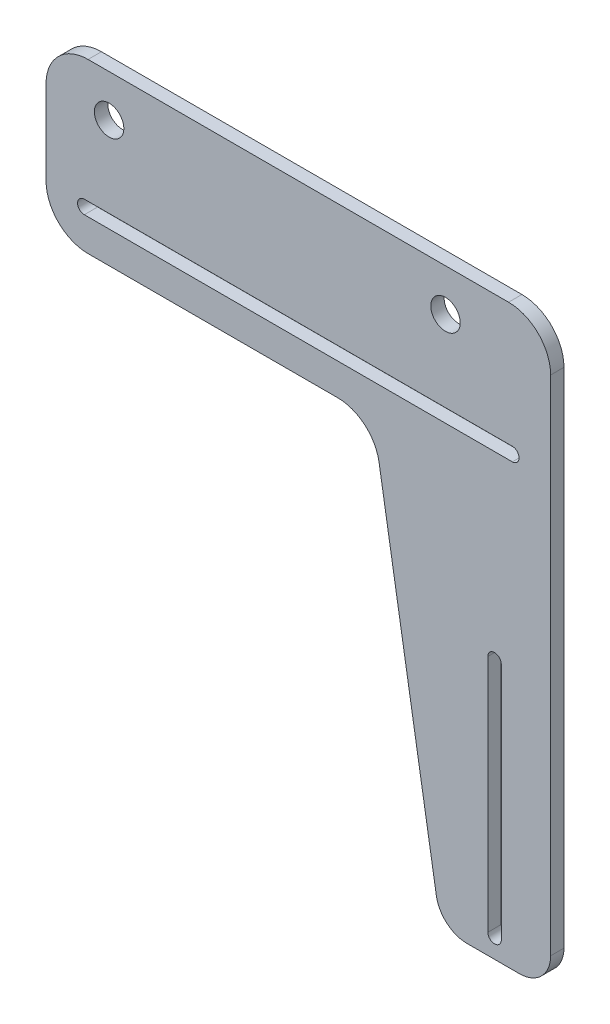
ISO-10303-21;
HEADER;
FILE_DESCRIPTION(('STEP AP214'),'2;1');
FILE_NAME('part.step','',(''),(''),'','','');
FILE_SCHEMA(('AUTOMOTIVE_DESIGN { 1 0 10303 214 1 1 1 1 }'));
ENDSEC;
DATA;
#1=APPLICATION_CONTEXT('core data for automotive mechanical design processes');
#2=APPLICATION_PROTOCOL_DEFINITION('international standard','automotive_design',2000,#1);
#3=PRODUCT_CONTEXT('',#1,'mechanical');
#4=PRODUCT('Part','Part','',(#3));
#5=PRODUCT_RELATED_PRODUCT_CATEGORY('part','',(#4));
#6=PRODUCT_DEFINITION_FORMATION('','',#4);
#7=PRODUCT_DEFINITION_CONTEXT('part definition',#1,'design');
#8=PRODUCT_DEFINITION('design','',#6,#7);
#9=PRODUCT_DEFINITION_SHAPE('','',#8);
#10=(LENGTH_UNIT() NAMED_UNIT(*) SI_UNIT(.MILLI.,.METRE.));
#11=(NAMED_UNIT(*) PLANE_ANGLE_UNIT() SI_UNIT($,.RADIAN.));
#12=(NAMED_UNIT(*) SI_UNIT($,.STERADIAN.) SOLID_ANGLE_UNIT());
#13=UNCERTAINTY_MEASURE_WITH_UNIT(LENGTH_MEASURE(1.E-05),#10,'distance_accuracy_value','');
#14=(GEOMETRIC_REPRESENTATION_CONTEXT(3) GLOBAL_UNCERTAINTY_ASSIGNED_CONTEXT((#13)) GLOBAL_UNIT_ASSIGNED_CONTEXT((#10,
#11,#12)) REPRESENTATION_CONTEXT('',''));
#15=CARTESIAN_POINT('',(0.,0.,0.));
#16=DIRECTION('',(0.,0.,1.));
#17=DIRECTION('',(1.,0.,0.));
#18=AXIS2_PLACEMENT_3D('',#15,#16,#17);
#19=CARTESIAN_POINT('',(40.132559776358,-74.617650604248,0.));
#20=DIRECTION('',(0.,0.,1.));
#21=DIRECTION('',(1.,0.,0.));
#22=AXIS2_PLACEMENT_3D('',#19,#20,#21);
#23=CYLINDRICAL_SURFACE('',#22,7.40000000000001);
#24=CARTESIAN_POINT('',(40.132559776358,-74.617650604248,3.175));
#25=DIRECTION('',(0.,0.,1.));
#26=DIRECTION('',(1.,0.,0.));
#27=AXIS2_PLACEMENT_3D('',#24,#25,#26);
#28=CIRCLE('',#27,7.40000000000001);
#29=CARTESIAN_POINT('',(32.8316512362823,-75.8246031672972,3.175));
#30=VERTEX_POINT('',#29);
#31=CARTESIAN_POINT('',(40.132559776358,-82.017650604248,3.175));
#32=VERTEX_POINT('',#31);
#33=EDGE_CURVE('E238',#30,#32,#28,.T.);
#34=ORIENTED_EDGE('',*,*,#33,.F.);
#35=DIRECTION('',(0.,0.,1.));
#36=VECTOR('',#35,1.);
#37=CARTESIAN_POINT('',(32.8316512362823,-75.8246031672972,0.));
#38=LINE('',#37,#36);
#39=CARTESIAN_POINT('',(32.8316512362823,-75.8246031672972,0.));
#40=VERTEX_POINT('',#39);
#41=EDGE_CURVE('E11',#40,#30,#38,.T.);
#42=ORIENTED_EDGE('',*,*,#41,.F.);
#43=CARTESIAN_POINT('',(40.132559776358,-74.617650604248,0.));
#44=DIRECTION('',(0.,0.,1.));
#45=DIRECTION('',(1.,0.,0.));
#46=AXIS2_PLACEMENT_3D('',#43,#44,#45);
#47=CIRCLE('',#46,7.40000000000001);
#48=CARTESIAN_POINT('',(40.132559776358,-82.017650604248,0.));
#49=VERTEX_POINT('',#48);
#50=EDGE_CURVE('E245',#40,#49,#47,.T.);
#51=ORIENTED_EDGE('',*,*,#50,.T.);
#52=DIRECTION('',(0.,0.,1.));
#53=VECTOR('',#52,1.);
#54=CARTESIAN_POINT('',(40.132559776358,-82.017650604248,0.));
#55=LINE('',#54,#53);
#56=EDGE_CURVE('E39',#49,#32,#55,.T.);
#57=ORIENTED_EDGE('',*,*,#56,.T.);
#58=EDGE_LOOP('',(#34,#42,#51,#57));
#59=FACE_BOUND('',#58,.T.);
#60=ADVANCED_FACE('F36',(#59),#23,.T.);
#61=CARTESIAN_POINT('',(19.2004680041138,6.63101697709338,0.));
#62=DIRECTION('',(-0.986609262172382,-0.163101697709337,0.));
#63=DIRECTION('',(0.163101697709337,-0.986609262172382,0.));
#64=AXIS2_PLACEMENT_3D('',#61,#62,#63);
#65=PLANE('',#64);
#66=DIRECTION('',(0.163101697709337,-0.986609262172382,0.));
#67=VECTOR('',#66,1.);
#68=CARTESIAN_POINT('',(19.2004680041138,6.63101697709338,3.175));
#69=LINE('',#68,#67);
#70=CARTESIAN_POINT('',(19.2004680041138,6.63101697709338,3.175));
#71=VERTEX_POINT('',#70);
#72=EDGE_CURVE('E249',#71,#30,#69,.T.);
#73=ORIENTED_EDGE('',*,*,#72,.F.);
#74=DIRECTION('',(0.,0.,1.));
#75=VECTOR('',#74,1.);
#76=CARTESIAN_POINT('',(19.2004680041138,6.63101697709338,0.));
#77=LINE('',#76,#75);
#78=CARTESIAN_POINT('',(19.2004680041138,6.63101697709338,0.));
#79=VERTEX_POINT('',#78);
#80=EDGE_CURVE('E44',#79,#71,#77,.T.);
#81=ORIENTED_EDGE('',*,*,#80,.F.);
#82=DIRECTION('',(0.163101697709337,-0.986609262172382,0.));
#83=VECTOR('',#82,1.);
#84=CARTESIAN_POINT('',(19.2004680041138,6.63101697709338,0.));
#85=LINE('',#84,#83);
#86=EDGE_CURVE('E279',#79,#40,#85,.T.);
#87=ORIENTED_EDGE('',*,*,#86,.T.);
#88=ORIENTED_EDGE('',*,*,#41,.T.);
#89=EDGE_LOOP('',(#73,#81,#87,#88));
#90=FACE_BOUND('',#89,.T.);
#91=ADVANCED_FACE('F345',(#90),#65,.T.);
#92=CARTESIAN_POINT('',(9.33437538238997,5.,0.));
#93=DIRECTION('',(0.,0.,1.));
#94=DIRECTION('',(1.,0.,0.));
#95=AXIS2_PLACEMENT_3D('',#92,#93,#94);
#96=CYLINDRICAL_SURFACE('',#95,10.);
#97=CARTESIAN_POINT('',(9.33437538238997,5.,3.175));
#98=DIRECTION('',(0.,0.,-1.));
#99=DIRECTION('',(-1.,0.,0.));
#100=AXIS2_PLACEMENT_3D('',#97,#98,#99);
#101=CIRCLE('',#100,10.);
#102=CARTESIAN_POINT('',(9.33437538238997,15.,3.175));
#103=VERTEX_POINT('',#102);
#104=EDGE_CURVE('E311',#103,#71,#101,.T.);
#105=ORIENTED_EDGE('',*,*,#104,.F.);
#106=DIRECTION('',(0.,0.,1.));
#107=VECTOR('',#106,1.);
#108=CARTESIAN_POINT('',(9.33437538238997,15.,0.));
#109=LINE('',#108,#107);
#110=CARTESIAN_POINT('',(9.33437538238997,15.,0.));
#111=VERTEX_POINT('',#110);
#112=EDGE_CURVE('E317',#111,#103,#109,.T.);
#113=ORIENTED_EDGE('',*,*,#112,.F.);
#114=CARTESIAN_POINT('',(9.33437538238997,5.,0.));
#115=DIRECTION('',(0.,0.,-1.));
#116=DIRECTION('',(-1.,0.,0.));
#117=AXIS2_PLACEMENT_3D('',#114,#115,#116);
#118=CIRCLE('',#117,10.);
#119=EDGE_CURVE('E276',#111,#79,#118,.T.);
#120=ORIENTED_EDGE('',*,*,#119,.T.);
#121=ORIENTED_EDGE('',*,*,#80,.T.);
#122=EDGE_LOOP('',(#105,#113,#120,#121));
#123=FACE_BOUND('',#122,.T.);
#124=ADVANCED_FACE('F382',(#123),#96,.F.);
#125=CARTESIAN_POINT('',(-50.,15.,0.));
#126=DIRECTION('',(0.,-1.,0.));
#127=DIRECTION('',(0.,0.,-1.));
#128=AXIS2_PLACEMENT_3D('',#125,#126,#127);
#129=PLANE('',#128);
#130=DIRECTION('',(1.,0.,0.));
#131=VECTOR('',#130,1.);
#132=CARTESIAN_POINT('',(-50.,15.,3.175));
#133=LINE('',#132,#131);
#134=CARTESIAN_POINT('',(-50.,15.,3.175));
#135=VERTEX_POINT('',#134);
#136=EDGE_CURVE('E308',#135,#103,#133,.T.);
#137=ORIENTED_EDGE('',*,*,#136,.F.);
#138=DIRECTION('',(0.,0.,1.));
#139=VECTOR('',#138,1.);
#140=CARTESIAN_POINT('',(-50.,15.,0.));
#141=LINE('',#140,#139);
#142=CARTESIAN_POINT('',(-50.,15.,0.));
#143=VERTEX_POINT('',#142);
#144=EDGE_CURVE('E319',#143,#135,#141,.T.);
#145=ORIENTED_EDGE('',*,*,#144,.F.);
#146=DIRECTION('',(1.,0.,0.));
#147=VECTOR('',#146,1.);
#148=CARTESIAN_POINT('',(-50.,15.,0.));
#149=LINE('',#148,#147);
#150=EDGE_CURVE('E273',#143,#111,#149,.T.);
#151=ORIENTED_EDGE('',*,*,#150,.T.);
#152=ORIENTED_EDGE('',*,*,#112,.T.);
#153=EDGE_LOOP('',(#137,#145,#151,#152));
#154=FACE_BOUND('',#153,.T.);
#155=ADVANCED_FACE('F379',(#154),#129,.T.);
#156=CARTESIAN_POINT('',(-50.,25.,0.));
#157=DIRECTION('',(0.,0.,1.));
#158=DIRECTION('',(1.,0.,0.));
#159=AXIS2_PLACEMENT_3D('',#156,#157,#158);
#160=CYLINDRICAL_SURFACE('',#159,10.);
#161=CARTESIAN_POINT('',(-50.,25.,3.175));
#162=DIRECTION('',(0.,0.,1.));
#163=DIRECTION('',(1.,0.,0.));
#164=AXIS2_PLACEMENT_3D('',#161,#162,#163);
#165=CIRCLE('',#164,10.);
#166=CARTESIAN_POINT('',(-60.,25.,3.175));
#167=VERTEX_POINT('',#166);
#168=EDGE_CURVE('E305',#167,#135,#165,.T.);
#169=ORIENTED_EDGE('',*,*,#168,.F.);
#170=DIRECTION('',(0.,0.,1.));
#171=VECTOR('',#170,1.);
#172=CARTESIAN_POINT('',(-60.,25.,0.));
#173=LINE('',#172,#171);
#174=CARTESIAN_POINT('',(-60.,25.,0.));
#175=VERTEX_POINT('',#174);
#176=EDGE_CURVE('E321',#175,#167,#173,.T.);
#177=ORIENTED_EDGE('',*,*,#176,.F.);
#178=CARTESIAN_POINT('',(-50.,25.,0.));
#179=DIRECTION('',(0.,0.,1.));
#180=DIRECTION('',(1.,0.,0.));
#181=AXIS2_PLACEMENT_3D('',#178,#179,#180);
#182=CIRCLE('',#181,10.);
#183=EDGE_CURVE('E270',#175,#143,#182,.T.);
#184=ORIENTED_EDGE('',*,*,#183,.T.);
#185=ORIENTED_EDGE('',*,*,#144,.T.);
#186=EDGE_LOOP('',(#169,#177,#184,#185));
#187=FACE_BOUND('',#186,.T.);
#188=ADVANCED_FACE('F376',(#187),#160,.T.);
#189=CARTESIAN_POINT('',(-60.,45.,0.));
#190=DIRECTION('',(-1.,0.,0.));
#191=DIRECTION('',(0.,0.,1.));
#192=AXIS2_PLACEMENT_3D('',#189,#190,#191);
#193=PLANE('',#192);
#194=DIRECTION('',(0.,-1.,0.));
#195=VECTOR('',#194,1.);
#196=CARTESIAN_POINT('',(-60.,45.,3.175));
#197=LINE('',#196,#195);
#198=CARTESIAN_POINT('',(-60.,45.,3.175));
#199=VERTEX_POINT('',#198);
#200=EDGE_CURVE('E302',#199,#167,#197,.T.);
#201=ORIENTED_EDGE('',*,*,#200,.F.);
#202=DIRECTION('',(0.,0.,1.));
#203=VECTOR('',#202,1.);
#204=CARTESIAN_POINT('',(-60.,45.,0.));
#205=LINE('',#204,#203);
#206=CARTESIAN_POINT('',(-60.,45.,0.));
#207=VERTEX_POINT('',#206);
#208=EDGE_CURVE('E323',#207,#199,#205,.T.);
#209=ORIENTED_EDGE('',*,*,#208,.F.);
#210=DIRECTION('',(0.,-1.,0.));
#211=VECTOR('',#210,1.);
#212=CARTESIAN_POINT('',(-60.,45.,0.));
#213=LINE('',#212,#211);
#214=EDGE_CURVE('E267',#207,#175,#213,.T.);
#215=ORIENTED_EDGE('',*,*,#214,.T.);
#216=ORIENTED_EDGE('',*,*,#176,.T.);
#217=EDGE_LOOP('',(#201,#209,#215,#216));
#218=FACE_BOUND('',#217,.T.);
#219=ADVANCED_FACE('F372',(#218),#193,.T.);
#220=CARTESIAN_POINT('',(-50.,45.,0.));
#221=DIRECTION('',(0.,0.,1.));
#222=DIRECTION('',(1.,0.,0.));
#223=AXIS2_PLACEMENT_3D('',#220,#221,#222);
#224=CYLINDRICAL_SURFACE('',#223,10.);
#225=CARTESIAN_POINT('',(-50.,45.,3.175));
#226=DIRECTION('',(0.,0.,1.));
#227=DIRECTION('',(1.,0.,0.));
#228=AXIS2_PLACEMENT_3D('',#225,#226,#227);
#229=CIRCLE('',#228,10.);
#230=CARTESIAN_POINT('',(-50.,55.,3.175));
#231=VERTEX_POINT('',#230);
#232=EDGE_CURVE('E299',#231,#199,#229,.T.);
#233=ORIENTED_EDGE('',*,*,#232,.F.);
#234=DIRECTION('',(0.,0.,1.));
#235=VECTOR('',#234,1.);
#236=CARTESIAN_POINT('',(-50.,55.,0.));
#237=LINE('',#236,#235);
#238=CARTESIAN_POINT('',(-50.,55.,0.));
#239=VERTEX_POINT('',#238);
#240=EDGE_CURVE('E325',#239,#231,#237,.T.);
#241=ORIENTED_EDGE('',*,*,#240,.F.);
#242=CARTESIAN_POINT('',(-50.,45.,0.));
#243=DIRECTION('',(0.,0.,1.));
#244=DIRECTION('',(1.,0.,0.));
#245=AXIS2_PLACEMENT_3D('',#242,#243,#244);
#246=CIRCLE('',#245,10.);
#247=EDGE_CURVE('E264',#239,#207,#246,.T.);
#248=ORIENTED_EDGE('',*,*,#247,.T.);
#249=ORIENTED_EDGE('',*,*,#208,.T.);
#250=EDGE_LOOP('',(#233,#241,#248,#249));
#251=FACE_BOUND('',#250,.T.);
#252=ADVANCED_FACE('F368',(#251),#224,.T.);
#253=CARTESIAN_POINT('',(50.0000000000003,55.,0.));
#254=DIRECTION('',(0.,1.,0.));
#255=DIRECTION('',(0.,0.,1.));
#256=AXIS2_PLACEMENT_3D('',#253,#254,#255);
#257=PLANE('',#256);
#258=DIRECTION('',(-1.,0.,0.));
#259=VECTOR('',#258,1.);
#260=CARTESIAN_POINT('',(50.0000000000003,55.,3.175));
#261=LINE('',#260,#259);
#262=CARTESIAN_POINT('',(50.0000000000003,55.,3.175));
#263=VERTEX_POINT('',#262);
#264=EDGE_CURVE('E296',#263,#231,#261,.T.);
#265=ORIENTED_EDGE('',*,*,#264,.F.);
#266=DIRECTION('',(0.,0.,1.));
#267=VECTOR('',#266,1.);
#268=CARTESIAN_POINT('',(50.0000000000003,55.,0.));
#269=LINE('',#268,#267);
#270=CARTESIAN_POINT('',(50.0000000000003,55.,0.));
#271=VERTEX_POINT('',#270);
#272=EDGE_CURVE('E327',#271,#263,#269,.T.);
#273=ORIENTED_EDGE('',*,*,#272,.F.);
#274=DIRECTION('',(-1.,0.,0.));
#275=VECTOR('',#274,1.);
#276=CARTESIAN_POINT('',(50.0000000000003,55.,0.));
#277=LINE('',#276,#275);
#278=EDGE_CURVE('E261',#271,#239,#277,.T.);
#279=ORIENTED_EDGE('',*,*,#278,.T.);
#280=ORIENTED_EDGE('',*,*,#240,.T.);
#281=EDGE_LOOP('',(#265,#273,#279,#280));
#282=FACE_BOUND('',#281,.T.);
#283=ADVANCED_FACE('F364',(#282),#257,.T.);
#284=CARTESIAN_POINT('',(50.0000000000003,45.,0.));
#285=DIRECTION('',(0.,0.,1.));
#286=DIRECTION('',(1.,0.,0.));
#287=AXIS2_PLACEMENT_3D('',#284,#285,#286);
#288=CYLINDRICAL_SURFACE('',#287,9.99999999999998);
#289=CARTESIAN_POINT('',(50.0000000000003,45.,3.175));
#290=DIRECTION('',(0.,0.,1.));
#291=DIRECTION('',(1.,0.,0.));
#292=AXIS2_PLACEMENT_3D('',#289,#290,#291);
#293=CIRCLE('',#292,9.99999999999998);
#294=CARTESIAN_POINT('',(60.0000000000003,45.,3.175));
#295=VERTEX_POINT('',#294);
#296=EDGE_CURVE('E293',#295,#263,#293,.T.);
#297=ORIENTED_EDGE('',*,*,#296,.F.);
#298=DIRECTION('',(0.,0.,1.));
#299=VECTOR('',#298,1.);
#300=CARTESIAN_POINT('',(60.0000000000003,45.,0.));
#301=LINE('',#300,#299);
#302=CARTESIAN_POINT('',(60.0000000000003,45.,0.));
#303=VERTEX_POINT('',#302);
#304=EDGE_CURVE('E329',#303,#295,#301,.T.);
#305=ORIENTED_EDGE('',*,*,#304,.F.);
#306=CARTESIAN_POINT('',(50.0000000000003,45.,0.));
#307=DIRECTION('',(0.,0.,1.));
#308=DIRECTION('',(1.,0.,0.));
#309=AXIS2_PLACEMENT_3D('',#306,#307,#308);
#310=CIRCLE('',#309,9.99999999999998);
#311=EDGE_CURVE('E258',#303,#271,#310,.T.);
#312=ORIENTED_EDGE('',*,*,#311,.T.);
#313=ORIENTED_EDGE('',*,*,#272,.T.);
#314=EDGE_LOOP('',(#297,#305,#312,#313));
#315=FACE_BOUND('',#314,.T.);
#316=ADVANCED_FACE('F360',(#315),#288,.T.);
#317=CARTESIAN_POINT('',(59.9999999999999,-74.617650604248,0.));
#318=DIRECTION('',(1.,0.,0.));
#319=DIRECTION('',(0.,1.,0.));
#320=AXIS2_PLACEMENT_3D('',#317,#318,#319);
#321=PLANE('',#320);
#322=DIRECTION('',(0.,1.,0.));
#323=VECTOR('',#322,1.);
#324=CARTESIAN_POINT('',(59.9999999999999,-74.617650604248,3.175));
#325=LINE('',#324,#323);
#326=CARTESIAN_POINT('',(59.9999999999999,-74.617650604248,3.175));
#327=VERTEX_POINT('',#326);
#328=EDGE_CURVE('E290',#327,#295,#325,.T.);
#329=ORIENTED_EDGE('',*,*,#328,.F.);
#330=DIRECTION('',(0.,0.,1.));
#331=VECTOR('',#330,1.);
#332=CARTESIAN_POINT('',(59.9999999999999,-74.617650604248,0.));
#333=LINE('',#332,#331);
#334=CARTESIAN_POINT('',(59.9999999999999,-74.617650604248,0.));
#335=VERTEX_POINT('',#334);
#336=EDGE_CURVE('E331',#335,#327,#333,.T.);
#337=ORIENTED_EDGE('',*,*,#336,.F.);
#338=DIRECTION('',(0.,1.,0.));
#339=VECTOR('',#338,1.);
#340=CARTESIAN_POINT('',(59.9999999999999,-74.617650604248,0.));
#341=LINE('',#340,#339);
#342=EDGE_CURVE('E255',#335,#303,#341,.T.);
#343=ORIENTED_EDGE('',*,*,#342,.T.);
#344=ORIENTED_EDGE('',*,*,#304,.T.);
#345=EDGE_LOOP('',(#329,#337,#343,#344));
#346=FACE_BOUND('',#345,.T.);
#347=ADVANCED_FACE('F358',(#346),#321,.T.);
#348=CARTESIAN_POINT('',(52.5999999999999,-74.617650604248,0.));
#349=DIRECTION('',(0.,0.,1.));
#350=DIRECTION('',(1.,0.,0.));
#351=AXIS2_PLACEMENT_3D('',#348,#349,#350);
#352=CYLINDRICAL_SURFACE('',#351,7.39999999999999);
#353=CARTESIAN_POINT('',(52.5999999999999,-74.617650604248,3.175));
#354=DIRECTION('',(0.,0.,1.));
#355=DIRECTION('',(1.,0.,0.));
#356=AXIS2_PLACEMENT_3D('',#353,#354,#355);
#357=CIRCLE('',#356,7.39999999999999);
#358=CARTESIAN_POINT('',(52.5999999999999,-82.017650604248,3.175));
#359=VERTEX_POINT('',#358);
#360=EDGE_CURVE('E287',#359,#327,#357,.T.);
#361=ORIENTED_EDGE('',*,*,#360,.F.);
#362=DIRECTION('',(0.,0.,1.));
#363=VECTOR('',#362,1.);
#364=CARTESIAN_POINT('',(52.5999999999999,-82.017650604248,0.));
#365=LINE('',#364,#363);
#366=CARTESIAN_POINT('',(52.5999999999999,-82.017650604248,0.));
#367=VERTEX_POINT('',#366);
#368=EDGE_CURVE('E332',#367,#359,#365,.T.);
#369=ORIENTED_EDGE('',*,*,#368,.F.);
#370=CARTESIAN_POINT('',(52.5999999999999,-74.617650604248,0.));
#371=DIRECTION('',(0.,0.,1.));
#372=DIRECTION('',(1.,0.,0.));
#373=AXIS2_PLACEMENT_3D('',#370,#371,#372);
#374=CIRCLE('',#373,7.39999999999999);
#375=EDGE_CURVE('E252',#367,#335,#374,.T.);
#376=ORIENTED_EDGE('',*,*,#375,.T.);
#377=ORIENTED_EDGE('',*,*,#336,.T.);
#378=EDGE_LOOP('',(#361,#369,#376,#377));
#379=FACE_BOUND('',#378,.T.);
#380=ADVANCED_FACE('F354',(#379),#352,.T.);
#381=CARTESIAN_POINT('',(40.132559776358,-82.017650604248,0.));
#382=DIRECTION('',(0.,-1.,0.));
#383=DIRECTION('',(1.,0.,0.));
#384=AXIS2_PLACEMENT_3D('',#381,#382,#383);
#385=PLANE('',#384);
#386=DIRECTION('',(1.,0.,0.));
#387=VECTOR('',#386,1.);
#388=CARTESIAN_POINT('',(40.132559776358,-82.017650604248,3.175));
#389=LINE('',#388,#387);
#390=EDGE_CURVE('E284',#32,#359,#389,.T.);
#391=ORIENTED_EDGE('',*,*,#390,.F.);
#392=ORIENTED_EDGE('',*,*,#56,.F.);
#393=DIRECTION('',(1.,0.,0.));
#394=VECTOR('',#393,1.);
#395=CARTESIAN_POINT('',(40.132559776358,-82.017650604248,0.));
#396=LINE('',#395,#394);
#397=EDGE_CURVE('E248',#49,#367,#396,.T.);
#398=ORIENTED_EDGE('',*,*,#397,.T.);
#399=ORIENTED_EDGE('',*,*,#368,.T.);
#400=EDGE_LOOP('',(#391,#392,#398,#399));
#401=FACE_BOUND('',#400,.T.);
#402=ADVANCED_FACE('F340',(#401),#385,.T.);
#403=CARTESIAN_POINT('',(40.132559776358,-74.617650604248,0.));
#404=DIRECTION('',(0.,0.,1.));
#405=DIRECTION('',(1.,0.,0.));
#406=AXIS2_PLACEMENT_3D('',#403,#404,#405);
#407=PLANE('',#406);
#408=CARTESIAN_POINT('',(35.,45.,0.));
#409=DIRECTION('',(0.,0.,1.));
#410=DIRECTION('',(1.,0.,0.));
#411=AXIS2_PLACEMENT_3D('',#408,#409,#410);
#412=CIRCLE('',#411,3.49999999999999);
#413=CARTESIAN_POINT('',(38.5,45.,0.));
#414=VERTEX_POINT('',#413);
#415=EDGE_CURVE('E604',#414,#414,#412,.T.);
#416=ORIENTED_EDGE('',*,*,#415,.T.);
#417=EDGE_LOOP('',(#416));
#418=FACE_BOUND('',#417,.T.);
#419=CARTESIAN_POINT('',(-45.,45.,0.));
#420=DIRECTION('',(0.,0.,1.));
#421=DIRECTION('',(1.,0.,0.));
#422=AXIS2_PLACEMENT_3D('',#419,#420,#421);
#423=CIRCLE('',#422,3.49999999999999);
#424=CARTESIAN_POINT('',(-41.5,45.,0.));
#425=VERTEX_POINT('',#424);
#426=EDGE_CURVE('E197',#425,#425,#423,.T.);
#427=ORIENTED_EDGE('',*,*,#426,.T.);
#428=EDGE_LOOP('',(#427));
#429=FACE_BOUND('',#428,.T.);
#430=DIRECTION('',(1.,0.,0.));
#431=VECTOR('',#430,1.);
#432=CARTESIAN_POINT('',(-50.9,25.7700005531317,0.));
#433=LINE('',#432,#431);
#434=CARTESIAN_POINT('',(-50.9,25.7700005531317,0.));
#435=VERTEX_POINT('',#434);
#436=CARTESIAN_POINT('',(50.9,25.7700005531317,0.));
#437=VERTEX_POINT('',#436);
#438=EDGE_CURVE('E203',#435,#437,#433,.T.);
#439=ORIENTED_EDGE('',*,*,#438,.F.);
#440=CARTESIAN_POINT('',(-50.9,24.1700005531317,0.));
#441=DIRECTION('',(0.,0.,-1.));
#442=DIRECTION('',(-1.,0.,0.));
#443=AXIS2_PLACEMENT_3D('',#440,#441,#442);
#444=CIRCLE('',#443,1.6);
#445=CARTESIAN_POINT('',(-50.9,22.5700005531317,0.));
#446=VERTEX_POINT('',#445);
#447=EDGE_CURVE('E52',#446,#435,#444,.T.);
#448=ORIENTED_EDGE('',*,*,#447,.F.);
#449=DIRECTION('',(-1.,0.,0.));
#450=VECTOR('',#449,1.);
#451=CARTESIAN_POINT('',(50.9,22.5700005531317,0.));
#452=LINE('',#451,#450);
#453=CARTESIAN_POINT('',(50.9,22.5700005531317,0.));
#454=VERTEX_POINT('',#453);
#455=EDGE_CURVE('E191',#454,#446,#452,.T.);
#456=ORIENTED_EDGE('',*,*,#455,.F.);
#457=CARTESIAN_POINT('',(50.9,24.1700005531317,0.));
#458=DIRECTION('',(0.,0.,-1.));
#459=DIRECTION('',(-1.,0.,0.));
#460=AXIS2_PLACEMENT_3D('',#457,#458,#459);
#461=CIRCLE('',#460,1.6);
#462=EDGE_CURVE('E194',#437,#454,#461,.T.);
#463=ORIENTED_EDGE('',*,*,#462,.F.);
#464=EDGE_LOOP('',(#439,#448,#456,#463));
#465=FACE_BOUND('',#464,.T.);
#466=DIRECTION('',(0.,1.,0.));
#467=VECTOR('',#466,1.);
#468=CARTESIAN_POINT('',(48.2718292236329,-77.2299994468682,0.));
#469=LINE('',#468,#467);
#470=CARTESIAN_POINT('',(48.2718292236329,-77.2299994468682,0.));
#471=VERTEX_POINT('',#470);
#472=CARTESIAN_POINT('',(48.2718292236327,-20.4299994468682,0.));
#473=VERTEX_POINT('',#472);
#474=EDGE_CURVE('E223',#471,#473,#469,.T.);
#475=ORIENTED_EDGE('',*,*,#474,.T.);
#476=CARTESIAN_POINT('',(46.6718292236327,-20.4299994468682,0.));
#477=DIRECTION('',(0.,0.,1.));
#478=DIRECTION('',(1.,0.,0.));
#479=AXIS2_PLACEMENT_3D('',#476,#477,#478);
#480=CIRCLE('',#479,1.6);
#481=CARTESIAN_POINT('',(45.0718292236327,-20.4299994468682,0.));
#482=VERTEX_POINT('',#481);
#483=EDGE_CURVE('E213',#473,#482,#480,.T.);
#484=ORIENTED_EDGE('',*,*,#483,.T.);
#485=DIRECTION('',(0.,-1.,0.));
#486=VECTOR('',#485,1.);
#487=CARTESIAN_POINT('',(45.0718292236327,-20.4299994468682,0.));
#488=LINE('',#487,#486);
#489=CARTESIAN_POINT('',(45.0718292236329,-77.2299994468682,0.));
#490=VERTEX_POINT('',#489);
#491=EDGE_CURVE('E216',#482,#490,#488,.T.);
#492=ORIENTED_EDGE('',*,*,#491,.T.);
#493=CARTESIAN_POINT('',(46.6718292236329,-77.2299994468682,0.));
#494=DIRECTION('',(0.,0.,1.));
#495=DIRECTION('',(1.,0.,0.));
#496=AXIS2_PLACEMENT_3D('',#493,#494,#495);
#497=CIRCLE('',#496,1.6);
#498=EDGE_CURVE('E220',#490,#471,#497,.T.);
#499=ORIENTED_EDGE('',*,*,#498,.T.);
#500=EDGE_LOOP('',(#475,#484,#492,#499));
#501=FACE_BOUND('',#500,.T.);
#502=ORIENTED_EDGE('',*,*,#50,.F.);
#503=ORIENTED_EDGE('',*,*,#86,.F.);
#504=ORIENTED_EDGE('',*,*,#119,.F.);
#505=ORIENTED_EDGE('',*,*,#150,.F.);
#506=ORIENTED_EDGE('',*,*,#183,.F.);
#507=ORIENTED_EDGE('',*,*,#214,.F.);
#508=ORIENTED_EDGE('',*,*,#247,.F.);
#509=ORIENTED_EDGE('',*,*,#278,.F.);
#510=ORIENTED_EDGE('',*,*,#311,.F.);
#511=ORIENTED_EDGE('',*,*,#342,.F.);
#512=ORIENTED_EDGE('',*,*,#375,.F.);
#513=ORIENTED_EDGE('',*,*,#397,.F.);
#514=EDGE_LOOP('',(#502,#503,#504,#505,#506,#507,#508,#509,#510,#511,#512,#513));
#515=FACE_BOUND('',#514,.T.);
#516=ADVANCED_FACE('F348',(#418,#429,#465,#501,#515),#407,.F.);
#517=CARTESIAN_POINT('',(40.132559776358,-74.617650604248,3.175));
#518=DIRECTION('',(0.,0.,1.));
#519=DIRECTION('',(1.,0.,0.));
#520=AXIS2_PLACEMENT_3D('',#517,#518,#519);
#521=PLANE('',#520);
#522=CARTESIAN_POINT('',(35.,45.,3.175));
#523=DIRECTION('',(0.,0.,1.));
#524=DIRECTION('',(1.,0.,0.));
#525=AXIS2_PLACEMENT_3D('',#522,#523,#524);
#526=CIRCLE('',#525,3.49999999999999);
#527=CARTESIAN_POINT('',(38.5,45.,3.175));
#528=VERTEX_POINT('',#527);
#529=EDGE_CURVE('E607',#528,#528,#526,.T.);
#530=ORIENTED_EDGE('',*,*,#529,.F.);
#531=EDGE_LOOP('',(#530));
#532=FACE_BOUND('',#531,.T.);
#533=CARTESIAN_POINT('',(-45.,45.,3.175));
#534=DIRECTION('',(0.,0.,1.));
#535=DIRECTION('',(1.,0.,0.));
#536=AXIS2_PLACEMENT_3D('',#533,#534,#535);
#537=CIRCLE('',#536,3.49999999999999);
#538=CARTESIAN_POINT('',(-41.5,45.,3.175));
#539=VERTEX_POINT('',#538);
#540=EDGE_CURVE('E609',#539,#539,#537,.T.);
#541=ORIENTED_EDGE('',*,*,#540,.F.);
#542=EDGE_LOOP('',(#541));
#543=FACE_BOUND('',#542,.T.);
#544=CARTESIAN_POINT('',(-50.9,24.1700005531317,3.175));
#545=DIRECTION('',(0.,0.,-1.));
#546=DIRECTION('',(-1.,0.,0.));
#547=AXIS2_PLACEMENT_3D('',#544,#545,#546);
#548=CIRCLE('',#547,1.6);
#549=CARTESIAN_POINT('',(-50.9,22.5700005531317,3.175));
#550=VERTEX_POINT('',#549);
#551=CARTESIAN_POINT('',(-50.9,25.7700005531317,3.175));
#552=VERTEX_POINT('',#551);
#553=EDGE_CURVE('E175',#550,#552,#548,.T.);
#554=ORIENTED_EDGE('',*,*,#553,.T.);
#555=DIRECTION('',(1.,0.,0.));
#556=VECTOR('',#555,1.);
#557=CARTESIAN_POINT('',(-50.9,25.7700005531317,3.175));
#558=LINE('',#557,#556);
#559=CARTESIAN_POINT('',(50.9,25.7700005531317,3.175));
#560=VERTEX_POINT('',#559);
#561=EDGE_CURVE('E184',#552,#560,#558,.T.);
#562=ORIENTED_EDGE('',*,*,#561,.T.);
#563=CARTESIAN_POINT('',(50.9,24.1700005531317,3.175));
#564=DIRECTION('',(0.,0.,-1.));
#565=DIRECTION('',(-1.,0.,0.));
#566=AXIS2_PLACEMENT_3D('',#563,#564,#565);
#567=CIRCLE('',#566,1.6);
#568=CARTESIAN_POINT('',(50.9,22.5700005531317,3.175));
#569=VERTEX_POINT('',#568);
#570=EDGE_CURVE('E60',#560,#569,#567,.T.);
#571=ORIENTED_EDGE('',*,*,#570,.T.);
#572=DIRECTION('',(-1.,0.,0.));
#573=VECTOR('',#572,1.);
#574=CARTESIAN_POINT('',(50.9,22.5700005531317,3.175));
#575=LINE('',#574,#573);
#576=EDGE_CURVE('E181',#569,#550,#575,.T.);
#577=ORIENTED_EDGE('',*,*,#576,.T.);
#578=EDGE_LOOP('',(#554,#562,#571,#577));
#579=FACE_BOUND('',#578,.T.);
#580=CARTESIAN_POINT('',(46.6718292236327,-20.4299994468682,3.175));
#581=DIRECTION('',(0.,0.,1.));
#582=DIRECTION('',(1.,0.,0.));
#583=AXIS2_PLACEMENT_3D('',#580,#581,#582);
#584=CIRCLE('',#583,1.6);
#585=CARTESIAN_POINT('',(48.2718292236327,-20.4299994468682,3.175));
#586=VERTEX_POINT('',#585);
#587=CARTESIAN_POINT('',(45.0718292236327,-20.4299994468682,3.175));
#588=VERTEX_POINT('',#587);
#589=EDGE_CURVE('E209',#586,#588,#584,.T.);
#590=ORIENTED_EDGE('',*,*,#589,.F.);
#591=DIRECTION('',(0.,1.,0.));
#592=VECTOR('',#591,1.);
#593=CARTESIAN_POINT('',(48.2718292236329,-77.2299994468682,3.175));
#594=LINE('',#593,#592);
#595=CARTESIAN_POINT('',(48.2718292236329,-77.2299994468682,3.175));
#596=VERTEX_POINT('',#595);
#597=EDGE_CURVE('E217',#596,#586,#594,.T.);
#598=ORIENTED_EDGE('',*,*,#597,.F.);
#599=CARTESIAN_POINT('',(46.6718292236329,-77.2299994468682,3.175));
#600=DIRECTION('',(0.,0.,1.));
#601=DIRECTION('',(1.,0.,0.));
#602=AXIS2_PLACEMENT_3D('',#599,#600,#601);
#603=CIRCLE('',#602,1.6);
#604=CARTESIAN_POINT('',(45.0718292236329,-77.2299994468682,3.175));
#605=VERTEX_POINT('',#604);
#606=EDGE_CURVE('E231',#605,#596,#603,.T.);
#607=ORIENTED_EDGE('',*,*,#606,.F.);
#608=DIRECTION('',(0.,-1.,0.));
#609=VECTOR('',#608,1.);
#610=CARTESIAN_POINT('',(45.0718292236327,-20.4299994468682,3.175));
#611=LINE('',#610,#609);
#612=EDGE_CURVE('E228',#588,#605,#611,.T.);
#613=ORIENTED_EDGE('',*,*,#612,.F.);
#614=EDGE_LOOP('',(#590,#598,#607,#613));
#615=FACE_BOUND('',#614,.T.);
#616=ORIENTED_EDGE('',*,*,#33,.T.);
#617=ORIENTED_EDGE('',*,*,#390,.T.);
#618=ORIENTED_EDGE('',*,*,#360,.T.);
#619=ORIENTED_EDGE('',*,*,#328,.T.);
#620=ORIENTED_EDGE('',*,*,#296,.T.);
#621=ORIENTED_EDGE('',*,*,#264,.T.);
#622=ORIENTED_EDGE('',*,*,#232,.T.);
#623=ORIENTED_EDGE('',*,*,#200,.T.);
#624=ORIENTED_EDGE('',*,*,#168,.T.);
#625=ORIENTED_EDGE('',*,*,#136,.T.);
#626=ORIENTED_EDGE('',*,*,#104,.T.);
#627=ORIENTED_EDGE('',*,*,#72,.T.);
#628=EDGE_LOOP('',(#616,#617,#618,#619,#620,#621,#622,#623,#624,#625,#626,#627));
#629=FACE_BOUND('',#628,.T.);
#630=ADVANCED_FACE('F188',(#532,#543,#579,#615,#629),#521,.T.);
#631=CARTESIAN_POINT('',(46.6718292236327,-20.4299994468682,0.));
#632=DIRECTION('',(0.,0.,1.));
#633=DIRECTION('',(1.,0.,0.));
#634=AXIS2_PLACEMENT_3D('',#631,#632,#633);
#635=CYLINDRICAL_SURFACE('',#634,1.6);
#636=ORIENTED_EDGE('',*,*,#589,.T.);
#637=DIRECTION('',(0.,0.,1.));
#638=VECTOR('',#637,1.);
#639=CARTESIAN_POINT('',(45.0718292236327,-20.4299994468682,0.));
#640=LINE('',#639,#638);
#641=EDGE_CURVE('E226',#482,#588,#640,.T.);
#642=ORIENTED_EDGE('',*,*,#641,.F.);
#643=ORIENTED_EDGE('',*,*,#483,.F.);
#644=DIRECTION('',(0.,0.,1.));
#645=VECTOR('',#644,1.);
#646=CARTESIAN_POINT('',(48.2718292236327,-20.4299994468682,0.));
#647=LINE('',#646,#645);
#648=EDGE_CURVE('E236',#473,#586,#647,.T.);
#649=ORIENTED_EDGE('',*,*,#648,.T.);
#650=EDGE_LOOP('',(#636,#642,#643,#649));
#651=FACE_BOUND('',#650,.T.);
#652=ADVANCED_FACE('F489',(#651),#635,.F.);
#653=CARTESIAN_POINT('',(48.2718292236329,-77.2299994468682,0.));
#654=DIRECTION('',(1.,0.,0.));
#655=DIRECTION('',(0.,1.,0.));
#656=AXIS2_PLACEMENT_3D('',#653,#654,#655);
#657=PLANE('',#656);
#658=ORIENTED_EDGE('',*,*,#597,.T.);
#659=ORIENTED_EDGE('',*,*,#648,.F.);
#660=ORIENTED_EDGE('',*,*,#474,.F.);
#661=DIRECTION('',(0.,0.,1.));
#662=VECTOR('',#661,1.);
#663=CARTESIAN_POINT('',(48.2718292236329,-77.2299994468682,0.));
#664=LINE('',#663,#662);
#665=EDGE_CURVE('E239',#471,#596,#664,.T.);
#666=ORIENTED_EDGE('',*,*,#665,.T.);
#667=EDGE_LOOP('',(#658,#659,#660,#666));
#668=FACE_BOUND('',#667,.T.);
#669=ADVANCED_FACE('F494',(#668),#657,.F.);
#670=CARTESIAN_POINT('',(46.6718292236329,-77.2299994468682,0.));
#671=DIRECTION('',(0.,0.,1.));
#672=DIRECTION('',(1.,0.,0.));
#673=AXIS2_PLACEMENT_3D('',#670,#671,#672);
#674=CYLINDRICAL_SURFACE('',#673,1.6);
#675=ORIENTED_EDGE('',*,*,#606,.T.);
#676=ORIENTED_EDGE('',*,*,#665,.F.);
#677=ORIENTED_EDGE('',*,*,#498,.F.);
#678=DIRECTION('',(0.,0.,1.));
#679=VECTOR('',#678,1.);
#680=CARTESIAN_POINT('',(45.0718292236329,-77.2299994468682,0.));
#681=LINE('',#680,#679);
#682=EDGE_CURVE('E241',#490,#605,#681,.T.);
#683=ORIENTED_EDGE('',*,*,#682,.T.);
#684=EDGE_LOOP('',(#675,#676,#677,#683));
#685=FACE_BOUND('',#684,.T.);
#686=ADVANCED_FACE('F506',(#685),#674,.F.);
#687=CARTESIAN_POINT('',(45.0718292236327,-20.4299994468682,0.));
#688=DIRECTION('',(-1.,0.,0.));
#689=DIRECTION('',(0.,-1.,0.));
#690=AXIS2_PLACEMENT_3D('',#687,#688,#689);
#691=PLANE('',#690);
#692=ORIENTED_EDGE('',*,*,#612,.T.);
#693=ORIENTED_EDGE('',*,*,#682,.F.);
#694=ORIENTED_EDGE('',*,*,#491,.F.);
#695=ORIENTED_EDGE('',*,*,#641,.T.);
#696=EDGE_LOOP('',(#692,#693,#694,#695));
#697=FACE_BOUND('',#696,.T.);
#698=ADVANCED_FACE('F516',(#697),#691,.F.);
#699=CARTESIAN_POINT('',(-50.9,24.1700005531317,3.175));
#700=DIRECTION('',(0.,0.,-1.));
#701=DIRECTION('',(-1.,0.,0.));
#702=AXIS2_PLACEMENT_3D('',#699,#700,#701);
#703=CYLINDRICAL_SURFACE('',#702,1.6);
#704=ORIENTED_EDGE('',*,*,#447,.T.);
#705=DIRECTION('',(0.,0.,-1.));
#706=VECTOR('',#705,1.);
#707=CARTESIAN_POINT('',(-50.9,25.7700005531317,3.175));
#708=LINE('',#707,#706);
#709=EDGE_CURVE('E171',#552,#435,#708,.T.);
#710=ORIENTED_EDGE('',*,*,#709,.F.);
#711=ORIENTED_EDGE('',*,*,#553,.F.);
#712=DIRECTION('',(0.,0.,-1.));
#713=VECTOR('',#712,1.);
#714=CARTESIAN_POINT('',(-50.9,22.5700005531317,3.175));
#715=LINE('',#714,#713);
#716=EDGE_CURVE('E207',#550,#446,#715,.T.);
#717=ORIENTED_EDGE('',*,*,#716,.T.);
#718=EDGE_LOOP('',(#704,#710,#711,#717));
#719=FACE_BOUND('',#718,.T.);
#720=ADVANCED_FACE('F173',(#719),#703,.F.);
#721=CARTESIAN_POINT('',(50.9,22.5700005531317,3.175));
#722=DIRECTION('',(0.,-1.,0.));
#723=DIRECTION('',(1.,0.,0.));
#724=AXIS2_PLACEMENT_3D('',#721,#722,#723);
#725=PLANE('',#724);
#726=ORIENTED_EDGE('',*,*,#455,.T.);
#727=ORIENTED_EDGE('',*,*,#716,.F.);
#728=ORIENTED_EDGE('',*,*,#576,.F.);
#729=DIRECTION('',(0.,0.,-1.));
#730=VECTOR('',#729,1.);
#731=CARTESIAN_POINT('',(50.9,22.5700005531317,3.175));
#732=LINE('',#731,#730);
#733=EDGE_CURVE('E210',#569,#454,#732,.T.);
#734=ORIENTED_EDGE('',*,*,#733,.T.);
#735=EDGE_LOOP('',(#726,#727,#728,#734));
#736=FACE_BOUND('',#735,.T.);
#737=ADVANCED_FACE('F535',(#736),#725,.F.);
#738=CARTESIAN_POINT('',(50.9,24.1700005531317,3.175));
#739=DIRECTION('',(0.,0.,-1.));
#740=DIRECTION('',(-1.,0.,0.));
#741=AXIS2_PLACEMENT_3D('',#738,#739,#740);
#742=CYLINDRICAL_SURFACE('',#741,1.6);
#743=ORIENTED_EDGE('',*,*,#462,.T.);
#744=ORIENTED_EDGE('',*,*,#733,.F.);
#745=ORIENTED_EDGE('',*,*,#570,.F.);
#746=DIRECTION('',(0.,0.,-1.));
#747=VECTOR('',#746,1.);
#748=CARTESIAN_POINT('',(50.9,25.7700005531317,3.175));
#749=LINE('',#748,#747);
#750=EDGE_CURVE('E180',#560,#437,#749,.T.);
#751=ORIENTED_EDGE('',*,*,#750,.T.);
#752=EDGE_LOOP('',(#743,#744,#745,#751));
#753=FACE_BOUND('',#752,.T.);
#754=ADVANCED_FACE('F544',(#753),#742,.F.);
#755=CARTESIAN_POINT('',(-50.9,25.7700005531317,3.175));
#756=DIRECTION('',(0.,1.,0.));
#757=DIRECTION('',(0.,0.,1.));
#758=AXIS2_PLACEMENT_3D('',#755,#756,#757);
#759=PLANE('',#758);
#760=ORIENTED_EDGE('',*,*,#438,.T.);
#761=ORIENTED_EDGE('',*,*,#750,.F.);
#762=ORIENTED_EDGE('',*,*,#561,.F.);
#763=ORIENTED_EDGE('',*,*,#709,.T.);
#764=EDGE_LOOP('',(#760,#761,#762,#763));
#765=FACE_BOUND('',#764,.T.);
#766=ADVANCED_FACE('F185',(#765),#759,.F.);
#767=CARTESIAN_POINT('',(-45.,45.,3.175));
#768=DIRECTION('',(0.,0.,1.));
#769=DIRECTION('',(1.,0.,0.));
#770=AXIS2_PLACEMENT_3D('',#767,#768,#769);
#771=CYLINDRICAL_SURFACE('',#770,3.49999999999999);
#772=ORIENTED_EDGE('',*,*,#426,.F.);
#773=EDGE_LOOP('',(#772));
#774=FACE_BOUND('',#773,.T.);
#775=ORIENTED_EDGE('',*,*,#540,.T.);
#776=EDGE_LOOP('',(#775));
#777=FACE_BOUND('',#776,.T.);
#778=ADVANCED_FACE('F562',(#774,#777),#771,.F.);
#779=CARTESIAN_POINT('',(35.,45.,3.175));
#780=DIRECTION('',(0.,0.,1.));
#781=DIRECTION('',(1.,0.,0.));
#782=AXIS2_PLACEMENT_3D('',#779,#780,#781);
#783=CYLINDRICAL_SURFACE('',#782,3.49999999999999);
#784=ORIENTED_EDGE('',*,*,#415,.F.);
#785=EDGE_LOOP('',(#784));
#786=FACE_BOUND('',#785,.T.);
#787=ORIENTED_EDGE('',*,*,#529,.T.);
#788=EDGE_LOOP('',(#787));
#789=FACE_BOUND('',#788,.T.);
#790=ADVANCED_FACE('F587',(#786,#789),#783,.F.);
#791=CLOSED_SHELL('',(#60,#91,#124,#155,#188,#219,#252,#283,#316,#347,#380,#402,#516,#630,#652,
#669,#686,#698,#720,#737,#754,#766,#778,#790));
#792=MANIFOLD_SOLID_BREP('B2',#791);
#793=ADVANCED_BREP_SHAPE_REPRESENTATION('',(#18,#792),#14);
#794=SHAPE_DEFINITION_REPRESENTATION(#9,#793);
ENDSEC;
END-ISO-10303-21;
